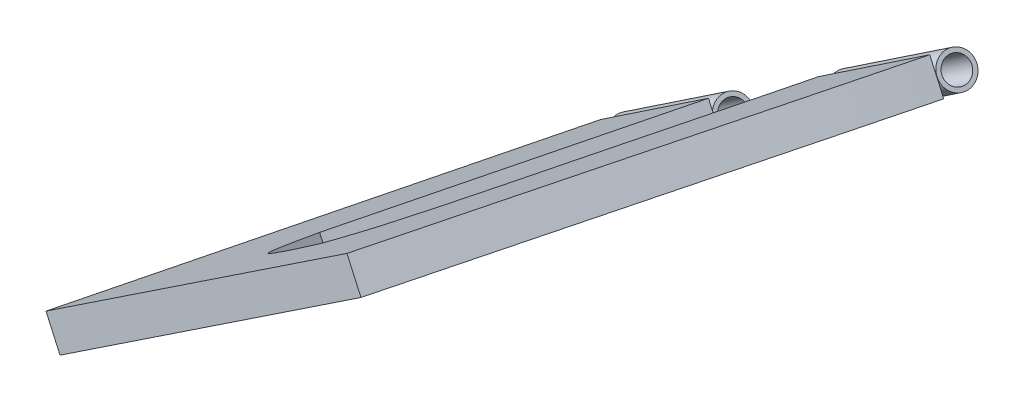
ISO-10303-21;
HEADER;
FILE_DESCRIPTION(('STEP AP214'),'2;1');
FILE_NAME('part.step','',(''),(''),'','','');
FILE_SCHEMA(('AUTOMOTIVE_DESIGN { 1 0 10303 214 1 1 1 1 }'));
ENDSEC;
DATA;
#1=APPLICATION_CONTEXT('core data for automotive mechanical design processes');
#2=APPLICATION_PROTOCOL_DEFINITION('international standard','automotive_design',2000,#1);
#3=PRODUCT_CONTEXT('',#1,'mechanical');
#4=PRODUCT('Part','Part','',(#3));
#5=PRODUCT_RELATED_PRODUCT_CATEGORY('part','',(#4));
#6=PRODUCT_DEFINITION_FORMATION('','',#4);
#7=PRODUCT_DEFINITION_CONTEXT('part definition',#1,'design');
#8=PRODUCT_DEFINITION('design','',#6,#7);
#9=PRODUCT_DEFINITION_SHAPE('','',#8);
#10=(LENGTH_UNIT() NAMED_UNIT(*) SI_UNIT(.MILLI.,.METRE.));
#11=(NAMED_UNIT(*) PLANE_ANGLE_UNIT() SI_UNIT($,.RADIAN.));
#12=(NAMED_UNIT(*) SI_UNIT($,.STERADIAN.) SOLID_ANGLE_UNIT());
#13=UNCERTAINTY_MEASURE_WITH_UNIT(LENGTH_MEASURE(1.E-05),#10,'distance_accuracy_value','');
#14=(GEOMETRIC_REPRESENTATION_CONTEXT(3) GLOBAL_UNCERTAINTY_ASSIGNED_CONTEXT((#13)) GLOBAL_UNIT_ASSIGNED_CONTEXT((#10,
#11,#12)) REPRESENTATION_CONTEXT('',''));
#15=CARTESIAN_POINT('',(0.,0.,0.));
#16=DIRECTION('',(0.,0.,1.));
#17=DIRECTION('',(1.,0.,0.));
#18=AXIS2_PLACEMENT_3D('',#15,#16,#17);
#19=CARTESIAN_POINT('',(19.5050040276974,22.1435396315675,34.0634331227611));
#20=DIRECTION('',(-0.781869774312816,-0.59028236601624,-0.20061501535602));
#21=DIRECTION('',(0.598047245201444,-0.619225348237719,-0.508821639287127));
#22=AXIS2_PLACEMENT_3D('',#19,#20,#21);
#23=CYLINDRICAL_SURFACE('',#22,0.5);
#24=CARTESIAN_POINT('',(5.61117813815865,11.6542219874589,30.4985042998846));
#25=DIRECTION('',(0.781869774312816,0.59028236601624,0.20061501535602));
#26=DIRECTION('',(-0.598047245201444,0.619225348237719,0.508821639287127));
#27=AXIS2_PLACEMENT_3D('',#24,#25,#26);
#28=CIRCLE('',#27,0.5);
#29=CARTESIAN_POINT('',(5.31215451555793,11.9638346615777,30.7529151195282));
#30=VERTEX_POINT('',#29);
#31=EDGE_CURVE('P0_E56',#30,#30,#28,.T.);
#32=ORIENTED_EDGE('',*,*,#31,.T.);
#33=EDGE_LOOP('',(#32));
#34=FACE_BOUND('',#33,.T.);
#35=CARTESIAN_POINT('',(9.95566959293279,14.9341501536491,31.6132298571932));
#36=DIRECTION('',(-0.781869774312816,-0.59028236601624,-0.200615015356018));
#37=DIRECTION('',(0.602531742011445,-0.798094919084599,0.));
#38=AXIS2_PLACEMENT_3D('',#35,#36,#37);
#39=CIRCLE('',#38,0.5);
#40=CARTESIAN_POINT('',(10.2569354639385,14.5351026941068,31.6132298571932));
#41=VERTEX_POINT('',#40);
#42=EDGE_CURVE('P0_E46',#41,#41,#39,.T.);
#43=ORIENTED_EDGE('',*,*,#42,.T.);
#44=EDGE_LOOP('',(#43));
#45=FACE_BOUND('',#44,.T.);
#46=ADVANCED_FACE('P0_F42',(#34,#45),#23,.T.);
#47=CARTESIAN_POINT('',(19.5050040276974,22.1435396315675,34.0634331227611));
#48=DIRECTION('',(-0.781869774312816,-0.59028236601624,-0.20061501535602));
#49=DIRECTION('',(0.598047245201444,-0.619225348237719,-0.508821639287127));
#50=AXIS2_PLACEMENT_3D('',#47,#48,#49);
#51=CYLINDRICAL_SURFACE('',#50,0.375);
#52=CARTESIAN_POINT('',(9.95566959293279,14.9341501536491,31.6132298571932));
#53=DIRECTION('',(-0.781869774312816,-0.59028236601624,-0.200615015356018));
#54=DIRECTION('',(0.602531742011445,-0.798094919084599,0.));
#55=AXIS2_PLACEMENT_3D('',#52,#53,#54);
#56=CIRCLE('',#55,0.375);
#57=CARTESIAN_POINT('',(10.1816189961871,14.6348645589924,31.6132298571932));
#58=VERTEX_POINT('',#57);
#59=EDGE_CURVE('P0_E11',#58,#58,#56,.T.);
#60=ORIENTED_EDGE('',*,*,#59,.F.);
#61=EDGE_LOOP('',(#60));
#62=FACE_BOUND('',#61,.T.);
#63=CARTESIAN_POINT('',(5.61117813815865,11.6542219874589,30.4985042998846));
#64=DIRECTION('',(0.781869774312816,0.59028236601624,0.20061501535602));
#65=DIRECTION('',(-0.598047245201444,0.619225348237719,0.508821639287127));
#66=AXIS2_PLACEMENT_3D('',#63,#64,#65);
#67=CIRCLE('',#66,0.375);
#68=CARTESIAN_POINT('',(5.38691042120811,11.886431493048,30.6893124146173));
#69=VERTEX_POINT('',#68);
#70=EDGE_CURVE('P0_E50',#69,#69,#67,.T.);
#71=ORIENTED_EDGE('',*,*,#70,.F.);
#72=EDGE_LOOP('',(#71));
#73=FACE_BOUND('',#72,.T.);
#74=ADVANCED_FACE('P0_F44',(#62,#73),#51,.F.);
#75=CARTESIAN_POINT('',(5.61117813815865,11.6542219874589,30.4985042998846));
#76=DIRECTION('',(0.781869774312816,0.59028236601624,0.20061501535602));
#77=DIRECTION('',(-0.598047245201444,0.619225348237719,0.508821639287127));
#78=AXIS2_PLACEMENT_3D('',#75,#76,#77);
#79=PLANE('',#78);
#80=ORIENTED_EDGE('',*,*,#31,.F.);
#81=EDGE_LOOP('',(#80));
#82=FACE_BOUND('',#81,.T.);
#83=ORIENTED_EDGE('',*,*,#70,.T.);
#84=EDGE_LOOP('',(#83));
#85=FACE_BOUND('',#84,.T.);
#86=ADVANCED_FACE('P0_F66',(#82,#85),#79,.F.);
#87=CARTESIAN_POINT('',(10.2581772978499,14.3322203466034,32.2053436603221));
#88=DIRECTION('',(-0.781869774312816,-0.59028236601624,-0.200615015356018));
#89=DIRECTION('',(0.602531742011445,-0.798094919084599,0.));
#90=AXIS2_PLACEMENT_3D('',#87,#88,#89);
#91=PLANE('',#90);
#92=ORIENTED_EDGE('',*,*,#59,.T.);
#93=EDGE_LOOP('',(#92));
#94=FACE_BOUND('',#93,.T.);
#95=ORIENTED_EDGE('',*,*,#42,.F.);
#96=EDGE_LOOP('',(#95));
#97=FACE_BOUND('',#96,.T.);
#98=ADVANCED_FACE('P0_F64',(#94,#97),#91,.F.);
#99=CLOSED_SHELL('',(#46,#74,#86,#98));
#100=MANIFOLD_SOLID_BREP('P0_B2',#99);
#101=CARTESIAN_POINT('',(19.5050040276974,22.1435396315675,34.0634331227611));
#102=DIRECTION('',(-0.781869774312816,-0.59028236601624,-0.20061501535602));
#103=DIRECTION('',(0.598047245201444,-0.619225348237719,-0.508821639287127));
#104=AXIS2_PLACEMENT_3D('',#101,#102,#103);
#105=CYLINDRICAL_SURFACE('',#104,0.5);
#106=CARTESIAN_POINT('',(14.6468882388097,18.4758443497466,32.8169199493294));
#107=DIRECTION('',(0.781869774312816,0.59028236601624,0.200615015356019));
#108=DIRECTION('',(-0.602531742011446,0.798094919084599,0.));
#109=AXIS2_PLACEMENT_3D('',#106,#107,#108);
#110=CIRCLE('',#109,0.5);
#111=CARTESIAN_POINT('',(14.345622367804,18.8748918092889,32.8169199493294));
#112=VERTEX_POINT('',#111);
#113=EDGE_CURVE('P0_E115',#112,#112,#110,.T.);
#114=ORIENTED_EDGE('',*,*,#113,.T.);
#115=EDGE_LOOP('',(#114));
#116=FACE_BOUND('',#115,.T.);
#117=CARTESIAN_POINT('',(19.127673674614,21.8586693617281,33.9666163163503));
#118=DIRECTION('',(0.781869774312816,0.590282366016239,0.200615015356022));
#119=DIRECTION('',(-0.602531742011445,0.798094919084599,0.));
#120=AXIS2_PLACEMENT_3D('',#117,#118,#119);
#121=CIRCLE('',#120,0.5);
#122=CARTESIAN_POINT('',(18.8264078036083,22.2577168212703,33.9666163163503));
#123=VERTEX_POINT('',#122);
#124=EDGE_CURVE('P0_E41',#123,#123,#121,.T.);
#125=ORIENTED_EDGE('',*,*,#124,.F.);
#126=EDGE_LOOP('',(#125));
#127=FACE_BOUND('',#126,.T.);
#128=ADVANCED_FACE('P0_F103',(#116,#127),#105,.T.);
#129=CARTESIAN_POINT('',(27.1092626428167,20.4664769242701,6.95579407217656));
#130=DIRECTION('',(0.781869774312816,0.590282366016239,0.200615015356022));
#131=DIRECTION('',(-0.602531742011445,0.798094919084599,0.));
#132=AXIS2_PLACEMENT_3D('',#129,#130,#131);
#133=PLANE('',#132);
#134=CARTESIAN_POINT('',(19.127673674614,21.8586693617281,33.9666163163503));
#135=DIRECTION('',(0.781869774312816,0.590282366016239,0.200615015356022));
#136=DIRECTION('',(-0.602531742011445,0.798094919084599,0.));
#137=AXIS2_PLACEMENT_3D('',#134,#135,#136);
#138=CIRCLE('',#137,0.375);
#139=CARTESIAN_POINT('',(18.9017242713598,22.1579549563848,33.9666163163503));
#140=VERTEX_POINT('',#139);
#141=EDGE_CURVE('P0_E110',#140,#140,#138,.T.);
#142=ORIENTED_EDGE('',*,*,#141,.F.);
#143=EDGE_LOOP('',(#142));
#144=FACE_BOUND('',#143,.T.);
#145=ORIENTED_EDGE('',*,*,#124,.T.);
#146=EDGE_LOOP('',(#145));
#147=FACE_BOUND('',#146,.T.);
#148=ADVANCED_FACE('P0_F129',(#144,#147),#133,.T.);
#149=CARTESIAN_POINT('',(19.5050040276974,22.1435396315675,34.0634331227611));
#150=DIRECTION('',(-0.781869774312816,-0.59028236601624,-0.20061501535602));
#151=DIRECTION('',(0.598047245201444,-0.619225348237719,-0.508821639287127));
#152=AXIS2_PLACEMENT_3D('',#149,#150,#151);
#153=CYLINDRICAL_SURFACE('',#152,0.375);
#154=CARTESIAN_POINT('',(14.6468882388097,18.4758443497466,32.8169199493294));
#155=DIRECTION('',(0.781869774312816,0.59028236601624,0.200615015356019));
#156=DIRECTION('',(-0.602531742011446,0.798094919084599,0.));
#157=AXIS2_PLACEMENT_3D('',#154,#155,#156);
#158=CIRCLE('',#157,0.375);
#159=CARTESIAN_POINT('',(14.4209388355554,18.7751299444033,32.8169199493294));
#160=VERTEX_POINT('',#159);
#161=EDGE_CURVE('P0_E106',#160,#160,#158,.T.);
#162=ORIENTED_EDGE('',*,*,#161,.F.);
#163=EDGE_LOOP('',(#162));
#164=FACE_BOUND('',#163,.T.);
#165=ORIENTED_EDGE('',*,*,#141,.T.);
#166=EDGE_LOOP('',(#165));
#167=FACE_BOUND('',#166,.T.);
#168=ADVANCED_FACE('P0_F126',(#164,#167),#153,.F.);
#169=CARTESIAN_POINT('',(15.67512091873,17.8791535546549,30.5652041528729));
#170=DIRECTION('',(0.781869774312816,0.59028236601624,0.200615015356019));
#171=DIRECTION('',(-0.602531742011446,0.798094919084599,0.));
#172=AXIS2_PLACEMENT_3D('',#169,#170,#171);
#173=PLANE('',#172);
#174=ORIENTED_EDGE('',*,*,#161,.T.);
#175=EDGE_LOOP('',(#174));
#176=FACE_BOUND('',#175,.T.);
#177=ORIENTED_EDGE('',*,*,#113,.F.);
#178=EDGE_LOOP('',(#177));
#179=FACE_BOUND('',#178,.T.);
#180=ADVANCED_FACE('P0_F123',(#176,#179),#173,.F.);
#181=CLOSED_SHELL('',(#128,#148,#168,#180));
#182=MANIFOLD_SOLID_BREP('P0_B6',#181);
#183=CARTESIAN_POINT('',(7.26501922296513,15.4270519133662,41.5587902049604));
#184=CARTESIAN_POINT('',(7.2976164194361,15.551587785396,42.1251138850178));
#185=CARTESIAN_POINT('',(7.26823719418708,15.6891769401001,43.0096827368454));
#186=CARTESIAN_POINT('',(7.60244055417108,16.0081661388842,43.4677460742567));
#187=CARTESIAN_POINT('',(7.98983633234174,16.3779262421248,43.9987156104588));
#188=CARTESIAN_POINT('',(9.6541262581043,17.6007849837899,44.2380331638712));
#189=CARTESIAN_POINT('',(9.9088475868817,17.7814569983442,44.2384348903075));
#190=CARTESIAN_POINT('',(10.2367446776835,18.0140320569228,44.2389520237977));
#191=CARTESIAN_POINT('',(10.9289973463403,18.4130640235347,43.7264651753653));
#192=CARTESIAN_POINT('',(11.1187478218495,18.489069909949,43.399654789482));
#193=CARTESIAN_POINT('',(11.9717845248691,18.8307597559581,41.9304555511749));
#194=CARTESIAN_POINT('',(12.291691204208,18.7430412563504,40.1741771631143));
#195=CARTESIAN_POINT('',(12.7271296346917,18.7616870977003,38.5544269821717));
#196=CARTESIAN_POINT('',(13.2050240644251,18.7821509407949,36.7767483602541));
#197=CARTESIAN_POINT('',(13.7398924876224,18.8499444253338,35.037789963945));
#198=CARTESIAN_POINT('',(14.145912517179,18.8097065214755,33.2057144803162));
#199=B_SPLINE_CURVE_WITH_KNOTS('',3,(#183,#184,#185,#186,#187,#188,#189,#190,#191,#192,#193,
#194,#195,#196,#197,#198),.UNSPECIFIED.,.F.,.F.,(4,3,3,3,3,4),(0.,1.,2.,3.,4.,5.),.UNSPECIFIED.);
#200=DIRECTION('',(0.572309542028559,-0.807194860020398,0.144562256691406));
#201=VECTOR('',#200,1.);
#202=SURFACE_OF_LINEAR_EXTRUSION('',#199,#201);
#203=CARTESIAN_POINT('',(7.83732876499369,14.6198570533458,41.7033524616518));
#204=CARTESIAN_POINT('',(7.86992596146466,14.7443929253756,42.2696761417092));
#205=CARTESIAN_POINT('',(7.84054673621564,14.8819820800797,43.1542449935368));
#206=CARTESIAN_POINT('',(8.17475009619964,15.2009712788638,43.6123083309481));
#207=CARTESIAN_POINT('',(8.5621458743703,15.5707313821044,44.1432778671502));
#208=CARTESIAN_POINT('',(10.2264358001329,16.7935901237695,44.3825954205626));
#209=CARTESIAN_POINT('',(10.4811571289103,16.9742621383238,44.3829971469989));
#210=CARTESIAN_POINT('',(10.809054219712,17.2068371969024,44.3835142804891));
#211=CARTESIAN_POINT('',(11.5013068883688,17.6058691635143,43.8710274320567));
#212=CARTESIAN_POINT('',(11.691057363878,17.6818750499286,43.5442170461734));
#213=CARTESIAN_POINT('',(12.5440940668977,18.0235648959377,42.0750178078663));
#214=CARTESIAN_POINT('',(12.8640007462366,17.93584639633,40.3187394198057));
#215=CARTESIAN_POINT('',(13.2994391767202,17.9544922376799,38.6989892388631));
#216=CARTESIAN_POINT('',(13.7773336064536,17.9749560807745,36.9213106169455));
#217=CARTESIAN_POINT('',(14.312202029651,18.0427495653134,35.1823522206364));
#218=CARTESIAN_POINT('',(14.7182220592075,18.0025116614551,33.3502767370076));
#219=B_SPLINE_CURVE_WITH_KNOTS('',3,(#203,#204,#205,#206,#207,#208,#209,#210,#211,#212,#213,
#214,#215,#216,#217,#218),.UNSPECIFIED.,.F.,.F.,(4,3,3,3,3,4),(0.,1.,2.,3.,4.,5.),.UNSPECIFIED.);
#220=CARTESIAN_POINT('',(7.83732876499369,14.6198570533458,41.7033524616518));
#221=VERTEX_POINT('',#220);
#222=CARTESIAN_POINT('',(14.7182220592075,18.0025116614551,33.3502767370076));
#223=VERTEX_POINT('',#222);
#224=EDGE_CURVE('P1_E56',#221,#223,#219,.T.);
#225=ORIENTED_EDGE('',*,*,#224,.F.);
#226=DIRECTION('',(0.572309542028559,-0.807194860020398,0.144562256691406));
#227=VECTOR('',#226,1.);
#228=CARTESIAN_POINT('',(7.26501922296513,15.4270519133662,41.5587902049604));
#229=LINE('',#228,#227);
#230=CARTESIAN_POINT('',(7.26501922296513,15.4270519133662,41.5587902049604));
#231=VERTEX_POINT('',#230);
#232=EDGE_CURVE('P1_E104',#231,#221,#229,.T.);
#233=ORIENTED_EDGE('',*,*,#232,.F.);
#234=CARTESIAN_POINT('',(14.1459125171788,18.8097065214754,33.2057144803162));
#235=VERTEX_POINT('',#234);
#236=EDGE_CURVE('P1_E135',#231,#235,#199,.T.);
#237=ORIENTED_EDGE('',*,*,#236,.T.);
#238=DIRECTION('',(0.572309542028559,-0.807194860020398,0.144562256691406));
#239=VECTOR('',#238,1.);
#240=CARTESIAN_POINT('',(14.145912517179,18.8097065214755,33.2057144803162));
#241=LINE('',#240,#239);
#242=EDGE_CURVE('P1_E143',#235,#223,#241,.T.);
#243=ORIENTED_EDGE('',*,*,#242,.T.);
#244=EDGE_LOOP('',(#225,#233,#237,#243));
#245=FACE_BOUND('',#244,.T.);
#246=ADVANCED_FACE('P1_F23',(#245),#202,.T.);
#247=CARTESIAN_POINT('',(7.26501922296513,15.4270519133662,41.5587902049604));
#248=DIRECTION('',(0.783989037472336,0.590275589206612,0.192187194968832));
#249=DIRECTION('',(0.240464087186137,-0.00334465894195798,-0.970652273489482));
#250=AXIS2_PLACEMENT_3D('',#247,#248,#249);
#251=PLANE('',#250);
#252=DIRECTION('',(-0.240464087186137,0.00334465894195801,0.970652273489482));
#253=VECTOR('',#252,1.);
#254=CARTESIAN_POINT('',(7.83732876499369,14.6198570533458,41.7033524616518));
#255=LINE('',#254,#253);
#256=CARTESIAN_POINT('',(10.1942393833203,14.587074352747,32.1894966636365));
#257=VERTEX_POINT('',#256);
#258=EDGE_CURVE('P1_E93',#257,#221,#255,.T.);
#259=ORIENTED_EDGE('',*,*,#258,.F.);
#260=DIRECTION('',(0.572309542028559,-0.807194860020398,0.144562256691406));
#261=VECTOR('',#260,1.);
#262=CARTESIAN_POINT('',(9.62192984129179,15.3942692127674,32.0449344069451));
#263=LINE('',#262,#261);
#264=CARTESIAN_POINT('',(9.62192984129179,15.3942692127674,32.0449344069451));
#265=VERTEX_POINT('',#264);
#266=EDGE_CURVE('P1_E144',#265,#257,#263,.T.);
#267=ORIENTED_EDGE('',*,*,#266,.F.);
#268=DIRECTION('',(-0.240464087186137,0.00334465894195801,0.970652273489482));
#269=VECTOR('',#268,1.);
#270=CARTESIAN_POINT('',(7.26501922296513,15.4270519133662,41.5587902049604));
#271=LINE('',#270,#269);
#272=EDGE_CURVE('P1_E108',#265,#231,#271,.T.);
#273=ORIENTED_EDGE('',*,*,#272,.T.);
#274=ORIENTED_EDGE('',*,*,#232,.T.);
#275=EDGE_LOOP('',(#259,#267,#273,#274));
#276=FACE_BOUND('',#275,.T.);
#277=ADVANCED_FACE('P1_F128',(#276),#251,.T.);
#278=CARTESIAN_POINT('',(14.6277075236501,21.8164738763719,48.0872701773663));
#279=DIRECTION('',(0.259597094567281,0.0111161668362736,-0.965653032578003));
#280=DIRECTION('',(-0.777863186296464,-0.590180386654385,-0.215907328762119));
#281=AXIS2_PLACEMENT_3D('',#278,#279,#280);
#282=PLANE('',#281);
#283=DIRECTION('',(0.777863186296464,0.590180386654385,0.215907328762119));
#284=VECTOR('',#283,1.);
#285=CARTESIAN_POINT('',(15.2000170656786,21.0092790163515,48.2318324340577));
#286=LINE('',#285,#284);
#287=CARTESIAN_POINT('',(2.48195396973143,11.3598296945523,44.7017476087971));
#288=VERTEX_POINT('',#287);
#289=CARTESIAN_POINT('',(15.2000170656786,21.0092790163515,48.2318324340577));
#290=VERTEX_POINT('',#289);
#291=EDGE_CURVE('P1_E76',#288,#290,#286,.T.);
#292=ORIENTED_EDGE('',*,*,#291,.T.);
#293=DIRECTION('',(0.572309542028559,-0.807194860020398,0.144562256691406));
#294=VECTOR('',#293,1.);
#295=CARTESIAN_POINT('',(14.6277075236501,21.8164738763719,48.0872701773663));
#296=LINE('',#295,#294);
#297=CARTESIAN_POINT('',(14.6277075236501,21.8164738763719,48.0872701773663));
#298=VERTEX_POINT('',#297);
#299=EDGE_CURVE('P1_E94',#298,#290,#296,.T.);
#300=ORIENTED_EDGE('',*,*,#299,.F.);
#301=DIRECTION('',(0.777863186296464,0.590180386654385,0.215907328762119));
#302=VECTOR('',#301,1.);
#303=CARTESIAN_POINT('',(14.6277075236501,21.8164738763719,48.0872701773663));
#304=LINE('',#303,#302);
#305=CARTESIAN_POINT('',(1.90964442770287,12.1670245545727,44.5571853521057));
#306=VERTEX_POINT('',#305);
#307=EDGE_CURVE('P1_E36',#306,#298,#304,.T.);
#308=ORIENTED_EDGE('',*,*,#307,.F.);
#309=DIRECTION('',(0.572309542028559,-0.807194860020398,0.144562256691406));
#310=VECTOR('',#309,1.);
#311=CARTESIAN_POINT('',(1.90964442770287,12.1670245545727,44.5571853521057));
#312=LINE('',#311,#310);
#313=EDGE_CURVE('P1_E86',#306,#288,#312,.T.);
#314=ORIENTED_EDGE('',*,*,#313,.T.);
#315=EDGE_LOOP('',(#292,#300,#308,#314));
#316=FACE_BOUND('',#315,.T.);
#317=ADVANCED_FACE('P1_F96',(#316),#282,.F.);
#318=CARTESIAN_POINT('',(14.6277075236501,21.8164738763719,48.0872701773663));
#319=CARTESIAN_POINT('',(15.6763196780103,21.9356583365785,44.601397241458));
#320=CARTESIAN_POINT('',(16.7133048834787,22.0459121939505,41.1116884294214));
#321=CARTESIAN_POINT('',(17.7735439867307,22.1740272569917,37.6296513696412));
#322=CARTESIAN_POINT('',(19.2247918608975,22.3493902598435,32.8634633793319));
#323=CARTESIAN_POINT('',(20.2947220750666,22.2339559388714,27.9831489903672));
#324=CARTESIAN_POINT('',(21.5313332606144,22.2458005648392,23.1536487041445));
#325=B_SPLINE_CURVE_WITH_KNOTS('',3,(#318,#319,#320,#321,#322,#323,#324),.UNSPECIFIED.,.F.,.F.,
(4,3,4),(0.,1.,2.),.UNSPECIFIED.);
#326=DIRECTION('',(0.572309542028559,-0.807194860020398,0.144562256691406));
#327=VECTOR('',#326,1.);
#328=SURFACE_OF_LINEAR_EXTRUSION('',#325,#327);
#329=CARTESIAN_POINT('',(15.2000170656786,21.0092790163515,48.2318324340577));
#330=CARTESIAN_POINT('',(16.2486292200388,21.1284634765581,44.7459594981494));
#331=CARTESIAN_POINT('',(17.2856144255072,21.2387173339301,41.2562506861128));
#332=CARTESIAN_POINT('',(18.3458535287593,21.3668323969713,37.7742136263326));
#333=CARTESIAN_POINT('',(19.7971014029261,21.5421953998231,33.0080256360233));
#334=CARTESIAN_POINT('',(20.8670316170952,21.426761078851,28.1277112470586));
#335=CARTESIAN_POINT('',(22.103642802643,21.4386057048188,23.2982109608359));
#336=B_SPLINE_CURVE_WITH_KNOTS('',3,(#329,#330,#331,#332,#333,#334,#335),.UNSPECIFIED.,.F.,.F.,
(4,3,4),(0.,1.,2.),.UNSPECIFIED.);
#337=CARTESIAN_POINT('',(19.2794724979884,21.4460847339179,34.5206191097166));
#338=VERTEX_POINT('',#337);
#339=EDGE_CURVE('P1_E98',#290,#338,#336,.T.);
#340=ORIENTED_EDGE('',*,*,#339,.T.);
#341=DIRECTION('',(-0.572309542028559,0.807194860020398,-0.144562256691406));
#342=VECTOR('',#341,1.);
#343=CARTESIAN_POINT('',(24.4302583762454,14.1813309937343,35.8216794199392));
#344=LINE('',#343,#342);
#345=CARTESIAN_POINT('',(18.7071629559598,22.2532795939383,34.3760568530252));
#346=VERTEX_POINT('',#345);
#347=EDGE_CURVE('P1_E181',#338,#346,#344,.T.);
#348=ORIENTED_EDGE('',*,*,#347,.T.);
#349=EDGE_CURVE('P1_E13',#298,#346,#325,.T.);
#350=ORIENTED_EDGE('',*,*,#349,.F.);
#351=ORIENTED_EDGE('',*,*,#299,.T.);
#352=EDGE_LOOP('',(#340,#348,#350,#351));
#353=FACE_BOUND('',#352,.T.);
#354=ADVANCED_FACE('P1_F122',(#353),#328,.F.);
#355=CARTESIAN_POINT('',(1.90964442770287,12.1670245545727,44.5571853521057));
#356=DIRECTION('',(0.78580869292244,0.590232627942746,0.1847434519525));
#357=DIRECTION('',(0.234449325506786,-0.00786783759688131,-0.972096502874567));
#358=AXIS2_PLACEMENT_3D('',#355,#356,#357);
#359=PLANE('',#358);
#360=DIRECTION('',(-0.234449325506786,0.00786783759688128,0.972096502874567));
#361=VECTOR('',#360,1.);
#362=CARTESIAN_POINT('',(1.90964442770287,12.1670245545727,44.5571853521057));
#363=LINE('',#362,#361);
#364=CARTESIAN_POINT('',(5.2009209744157,12.0565732692044,30.9105757312987));
#365=VERTEX_POINT('',#364);
#366=EDGE_CURVE('P1_E151',#365,#306,#363,.T.);
#367=ORIENTED_EDGE('',*,*,#366,.F.);
#368=DIRECTION('',(-0.572309542028559,0.807194860020398,-0.144562256691406));
#369=VECTOR('',#368,1.);
#370=CARTESIAN_POINT('',(10.9240163947013,3.98462466900043,32.3561982982128));
#371=LINE('',#370,#369);
#372=CARTESIAN_POINT('',(5.77323051644426,11.249378409184,31.0551379879901));
#373=VERTEX_POINT('',#372);
#374=EDGE_CURVE('P1_E89',#373,#365,#371,.T.);
#375=ORIENTED_EDGE('',*,*,#374,.F.);
#376=DIRECTION('',(-0.234449325506786,0.00786783759688128,0.972096502874567));
#377=VECTOR('',#376,1.);
#378=CARTESIAN_POINT('',(2.48195396973143,11.3598296945523,44.7017476087971));
#379=LINE('',#378,#377);
#380=EDGE_CURVE('P1_E83',#373,#288,#379,.T.);
#381=ORIENTED_EDGE('',*,*,#380,.T.);
#382=ORIENTED_EDGE('',*,*,#313,.F.);
#383=EDGE_LOOP('',(#367,#375,#381,#382));
#384=FACE_BOUND('',#383,.T.);
#385=ADVANCED_FACE('P1_F85',(#384),#359,.F.);
#386=CARTESIAN_POINT('',(42.4932399000705,28.5785978709503,-17.5547484149669));
#387=DIRECTION('',(-0.572309542028559,0.807194860020398,-0.144562256691406));
#388=DIRECTION('',(-0.0457805412974336,0.144562256691406,0.988436085935151));
#389=AXIS2_PLACEMENT_3D('',#386,#387,#388);
#390=PLANE('',#389);
#391=ORIENTED_EDGE('',*,*,#380,.F.);
#392=DIRECTION('',(0.781869774312816,0.59028236601624,0.20061501535602));
#393=VECTOR('',#392,1.);
#394=CARTESIAN_POINT('',(28.5940741067789,28.4782597287473,36.9105937655665));
#395=LINE('',#394,#393);
#396=EDGE_CURVE('P1_E162',#373,#257,#395,.T.);
#397=ORIENTED_EDGE('',*,*,#396,.T.);
#398=ORIENTED_EDGE('',*,*,#258,.T.);
#399=ORIENTED_EDGE('',*,*,#224,.T.);
#400=EDGE_CURVE('P1_E67',#223,#338,#395,.T.);
#401=ORIENTED_EDGE('',*,*,#400,.T.);
#402=ORIENTED_EDGE('',*,*,#339,.F.);
#403=ORIENTED_EDGE('',*,*,#291,.F.);
#404=EDGE_LOOP('',(#391,#397,#398,#399,#401,#402,#403));
#405=FACE_BOUND('',#404,.T.);
#406=ADVANCED_FACE('P1_F101',(#405),#390,.F.);
#407=CARTESIAN_POINT('',(41.920930358042,29.3857927309707,-17.6993106716583));
#408=DIRECTION('',(-0.572309542028559,0.807194860020398,-0.144562256691406));
#409=DIRECTION('',(-0.0457805412974336,0.144562256691406,0.988436085935151));
#410=AXIS2_PLACEMENT_3D('',#407,#408,#409);
#411=PLANE('',#410);
#412=DIRECTION('',(0.781869774312816,0.59028236601624,0.20061501535602));
#413=VECTOR('',#412,1.);
#414=CARTESIAN_POINT('',(18.7071629559598,22.2532795939383,34.3760568530252));
#415=LINE('',#414,#413);
#416=EDGE_CURVE('P1_E179',#365,#265,#415,.T.);
#417=ORIENTED_EDGE('',*,*,#416,.F.);
#418=ORIENTED_EDGE('',*,*,#366,.T.);
#419=ORIENTED_EDGE('',*,*,#307,.T.);
#420=ORIENTED_EDGE('',*,*,#349,.T.);
#421=EDGE_CURVE('P1_E185',#235,#346,#415,.T.);
#422=ORIENTED_EDGE('',*,*,#421,.F.);
#423=ORIENTED_EDGE('',*,*,#236,.F.);
#424=ORIENTED_EDGE('',*,*,#272,.F.);
#425=EDGE_LOOP('',(#417,#418,#419,#420,#422,#423,#424));
#426=FACE_BOUND('',#425,.T.);
#427=ADVANCED_FACE('P1_F25',(#426),#411,.T.);
#428=CARTESIAN_POINT('',(24.4302583762454,14.1813309937343,35.8216794199392));
#429=DIRECTION('',(-0.247267960154743,-0.00178502854899554,0.968945493592902));
#430=DIRECTION('',(0.781869774312816,0.59028236601624,0.20061501535602));
#431=AXIS2_PLACEMENT_3D('',#428,#429,#430);
#432=PLANE('',#431);
#433=ORIENTED_EDGE('',*,*,#374,.T.);
#434=ORIENTED_EDGE('',*,*,#416,.T.);
#435=ORIENTED_EDGE('',*,*,#266,.T.);
#436=ORIENTED_EDGE('',*,*,#396,.F.);
#437=EDGE_LOOP('',(#433,#434,#435,#436));
#438=FACE_BOUND('',#437,.T.);
#439=ADVANCED_FACE('P1_F178',(#438),#432,.F.);
#440=ORIENTED_EDGE('',*,*,#242,.F.);
#441=ORIENTED_EDGE('',*,*,#421,.T.);
#442=ORIENTED_EDGE('',*,*,#347,.F.);
#443=ORIENTED_EDGE('',*,*,#400,.F.);
#444=EDGE_LOOP('',(#440,#441,#442,#443));
#445=FACE_BOUND('',#444,.T.);
#446=ADVANCED_FACE('P1_F200',(#445),#432,.F.);
#447=CLOSED_SHELL('',(#246,#277,#317,#354,#385,#406,#427,#439,#446));
#448=MANIFOLD_SOLID_BREP('P1_B1',#447);
#449=ADVANCED_BREP_SHAPE_REPRESENTATION('',(#18,#100,#182,#448),#14);
#450=SHAPE_DEFINITION_REPRESENTATION(#9,#449);
ENDSEC;
END-ISO-10303-21;
